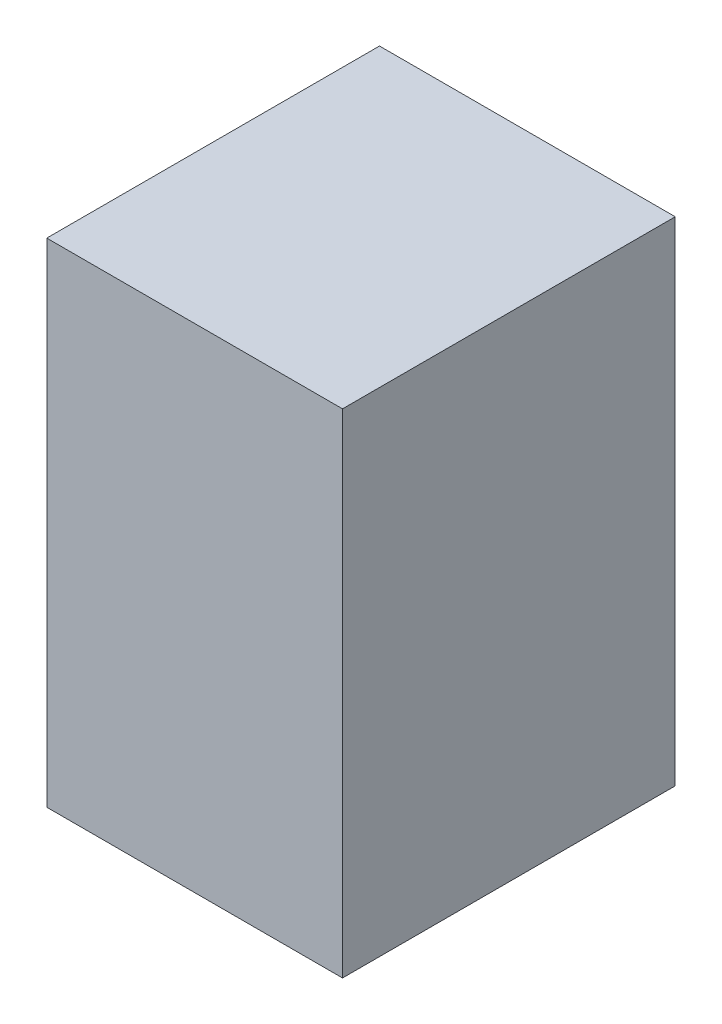
ISO-10303-21;
HEADER;
FILE_DESCRIPTION(('STEP AP214'),'2;1');
FILE_NAME('part.step','',(''),(''),'','','');
FILE_SCHEMA(('AUTOMOTIVE_DESIGN { 1 0 10303 214 1 1 1 1 }'));
ENDSEC;
DATA;
#1=APPLICATION_CONTEXT('core data for automotive mechanical design processes');
#2=APPLICATION_PROTOCOL_DEFINITION('international standard','automotive_design',2000,#1);
#3=PRODUCT_CONTEXT('',#1,'mechanical');
#4=PRODUCT('Part','Part','',(#3));
#5=PRODUCT_RELATED_PRODUCT_CATEGORY('part','',(#4));
#6=PRODUCT_DEFINITION_FORMATION('','',#4);
#7=PRODUCT_DEFINITION_CONTEXT('part definition',#1,'design');
#8=PRODUCT_DEFINITION('design','',#6,#7);
#9=PRODUCT_DEFINITION_SHAPE('','',#8);
#10=(LENGTH_UNIT() NAMED_UNIT(*) SI_UNIT(.MILLI.,.METRE.));
#11=(NAMED_UNIT(*) PLANE_ANGLE_UNIT() SI_UNIT($,.RADIAN.));
#12=(NAMED_UNIT(*) SI_UNIT($,.STERADIAN.) SOLID_ANGLE_UNIT());
#13=UNCERTAINTY_MEASURE_WITH_UNIT(LENGTH_MEASURE(1.E-05),#10,'distance_accuracy_value','');
#14=(GEOMETRIC_REPRESENTATION_CONTEXT(3) GLOBAL_UNCERTAINTY_ASSIGNED_CONTEXT((#13)) GLOBAL_UNIT_ASSIGNED_CONTEXT((#10,
#11,#12)) REPRESENTATION_CONTEXT('',''));
#15=CARTESIAN_POINT('',(0.,0.,0.));
#16=DIRECTION('',(0.,0.,1.));
#17=DIRECTION('',(1.,0.,0.));
#18=AXIS2_PLACEMENT_3D('',#15,#16,#17);
#19=CARTESIAN_POINT('',(0.5999988,1.00000054,0.));
#20=DIRECTION('',(1.,0.,0.));
#21=DIRECTION('',(0.,0.,-1.));
#22=AXIS2_PLACEMENT_3D('',#19,#20,#21);
#23=PLANE('',#22);
#24=DIRECTION('',(0.,0.,-1.));
#25=VECTOR('',#24,1.);
#26=CARTESIAN_POINT('',(0.5999988,-1.00000054,0.));
#27=LINE('',#26,#25);
#28=CARTESIAN_POINT('',(0.5999988,-1.00000054,0.));
#29=VERTEX_POINT('',#28);
#30=CARTESIAN_POINT('',(0.5999988,-1.00000054,1.34999984));
#31=VERTEX_POINT('',#30);
#32=EDGE_CURVE('E19',#29,#31,#27,.F.);
#33=ORIENTED_EDGE('',*,*,#32,.F.);
#34=DIRECTION('',(0.,1.,0.));
#35=VECTOR('',#34,1.);
#36=CARTESIAN_POINT('',(0.5999988,-1.00000054,0.));
#37=LINE('',#36,#35);
#38=CARTESIAN_POINT('',(0.5999988,1.00000054,0.));
#39=VERTEX_POINT('',#38);
#40=EDGE_CURVE('E79',#29,#39,#37,.T.);
#41=ORIENTED_EDGE('',*,*,#40,.T.);
#42=DIRECTION('',(0.,0.,1.));
#43=VECTOR('',#42,1.);
#44=CARTESIAN_POINT('',(0.5999988,1.00000054,0.));
#45=LINE('',#44,#43);
#46=CARTESIAN_POINT('',(0.5999988,1.00000054,1.34999984));
#47=VERTEX_POINT('',#46);
#48=EDGE_CURVE('E67',#47,#39,#45,.F.);
#49=ORIENTED_EDGE('',*,*,#48,.F.);
#50=DIRECTION('',(0.,1.,0.));
#51=VECTOR('',#50,1.);
#52=CARTESIAN_POINT('',(0.5999988,-1.00000054,1.34999984));
#53=LINE('',#52,#51);
#54=EDGE_CURVE('E55',#31,#47,#53,.T.);
#55=ORIENTED_EDGE('',*,*,#54,.F.);
#56=EDGE_LOOP('',(#33,#41,#49,#55));
#57=FACE_BOUND('',#56,.T.);
#58=ADVANCED_FACE('F16',(#57),#23,.T.);
#59=CARTESIAN_POINT('',(0.5999988,-1.00000054,0.));
#60=DIRECTION('',(0.,-1.,0.));
#61=DIRECTION('',(0.,0.,-1.));
#62=AXIS2_PLACEMENT_3D('',#59,#60,#61);
#63=PLANE('',#62);
#64=DIRECTION('',(0.,0.,1.));
#65=VECTOR('',#64,1.);
#66=CARTESIAN_POINT('',(-0.5999988,-1.00000054,0.));
#67=LINE('',#66,#65);
#68=CARTESIAN_POINT('',(-0.5999988,-1.00000054,0.));
#69=VERTEX_POINT('',#68);
#70=CARTESIAN_POINT('',(-0.5999988,-1.00000054,1.34999984));
#71=VERTEX_POINT('',#70);
#72=EDGE_CURVE('E82',#69,#71,#67,.T.);
#73=ORIENTED_EDGE('',*,*,#72,.F.);
#74=DIRECTION('',(1.,0.,0.));
#75=VECTOR('',#74,1.);
#76=CARTESIAN_POINT('',(-0.5999988,-1.00000054,0.));
#77=LINE('',#76,#75);
#78=EDGE_CURVE('E64',#69,#29,#77,.T.);
#79=ORIENTED_EDGE('',*,*,#78,.T.);
#80=ORIENTED_EDGE('',*,*,#32,.T.);
#81=DIRECTION('',(1.,0.,0.));
#82=VECTOR('',#81,1.);
#83=CARTESIAN_POINT('',(-0.5999988,-1.00000054,1.34999984));
#84=LINE('',#83,#82);
#85=EDGE_CURVE('E61',#71,#31,#84,.T.);
#86=ORIENTED_EDGE('',*,*,#85,.F.);
#87=EDGE_LOOP('',(#73,#79,#80,#86));
#88=FACE_BOUND('',#87,.T.);
#89=ADVANCED_FACE('F60',(#88),#63,.T.);
#90=CARTESIAN_POINT('',(-0.5999988,-1.00000054,1.34999984));
#91=DIRECTION('',(0.,0.,1.));
#92=DIRECTION('',(1.,0.,0.));
#93=AXIS2_PLACEMENT_3D('',#90,#91,#92);
#94=PLANE('',#93);
#95=DIRECTION('',(1.,0.,0.));
#96=VECTOR('',#95,1.);
#97=CARTESIAN_POINT('',(-0.5999988,1.00000054,1.34999984));
#98=LINE('',#97,#96);
#99=CARTESIAN_POINT('',(-0.5999988,1.00000054,1.34999984));
#100=VERTEX_POINT('',#99);
#101=EDGE_CURVE('E69',#100,#47,#98,.T.);
#102=ORIENTED_EDGE('',*,*,#101,.F.);
#103=DIRECTION('',(0.,1.,0.));
#104=VECTOR('',#103,1.);
#105=CARTESIAN_POINT('',(-0.5999988,-1.00000054,1.34999984));
#106=LINE('',#105,#104);
#107=EDGE_CURVE('E73',#71,#100,#106,.T.);
#108=ORIENTED_EDGE('',*,*,#107,.F.);
#109=ORIENTED_EDGE('',*,*,#85,.T.);
#110=ORIENTED_EDGE('',*,*,#54,.T.);
#111=EDGE_LOOP('',(#102,#108,#109,#110));
#112=FACE_BOUND('',#111,.T.);
#113=ADVANCED_FACE('F71',(#112),#94,.T.);
#114=CARTESIAN_POINT('',(-0.5999988,1.00000054,0.));
#115=DIRECTION('',(0.,1.,0.));
#116=DIRECTION('',(0.,0.,1.));
#117=AXIS2_PLACEMENT_3D('',#114,#115,#116);
#118=PLANE('',#117);
#119=ORIENTED_EDGE('',*,*,#48,.T.);
#120=DIRECTION('',(1.,0.,0.));
#121=VECTOR('',#120,1.);
#122=CARTESIAN_POINT('',(-0.5999988,1.00000054,0.));
#123=LINE('',#122,#121);
#124=CARTESIAN_POINT('',(-0.5999988,1.00000054,0.));
#125=VERTEX_POINT('',#124);
#126=EDGE_CURVE('E34',#39,#125,#123,.F.);
#127=ORIENTED_EDGE('',*,*,#126,.T.);
#128=DIRECTION('',(0.,0.,1.));
#129=VECTOR('',#128,1.);
#130=CARTESIAN_POINT('',(-0.5999988,1.00000054,0.));
#131=LINE('',#130,#129);
#132=EDGE_CURVE('E25',#100,#125,#131,.F.);
#133=ORIENTED_EDGE('',*,*,#132,.F.);
#134=ORIENTED_EDGE('',*,*,#101,.T.);
#135=EDGE_LOOP('',(#119,#127,#133,#134));
#136=FACE_BOUND('',#135,.T.);
#137=ADVANCED_FACE('F88',(#136),#118,.T.);
#138=CARTESIAN_POINT('',(-0.5999988,-1.00000054,0.));
#139=DIRECTION('',(0.,0.,1.));
#140=DIRECTION('',(1.,0.,0.));
#141=AXIS2_PLACEMENT_3D('',#138,#139,#140);
#142=PLANE('',#141);
#143=ORIENTED_EDGE('',*,*,#126,.F.);
#144=ORIENTED_EDGE('',*,*,#40,.F.);
#145=ORIENTED_EDGE('',*,*,#78,.F.);
#146=DIRECTION('',(0.,1.,0.));
#147=VECTOR('',#146,1.);
#148=CARTESIAN_POINT('',(-0.5999988,-1.00000054,0.));
#149=LINE('',#148,#147);
#150=EDGE_CURVE('E11',#125,#69,#149,.F.);
#151=ORIENTED_EDGE('',*,*,#150,.F.);
#152=EDGE_LOOP('',(#143,#144,#145,#151));
#153=FACE_BOUND('',#152,.T.);
#154=ADVANCED_FACE('F90',(#153),#142,.F.);
#155=CARTESIAN_POINT('',(-0.5999988,-1.00000054,0.));
#156=DIRECTION('',(-1.,0.,0.));
#157=DIRECTION('',(0.,0.,1.));
#158=AXIS2_PLACEMENT_3D('',#155,#156,#157);
#159=PLANE('',#158);
#160=ORIENTED_EDGE('',*,*,#132,.T.);
#161=ORIENTED_EDGE('',*,*,#150,.T.);
#162=ORIENTED_EDGE('',*,*,#72,.T.);
#163=ORIENTED_EDGE('',*,*,#107,.T.);
#164=EDGE_LOOP('',(#160,#161,#162,#163));
#165=FACE_BOUND('',#164,.T.);
#166=ADVANCED_FACE('F87',(#165),#159,.T.);
#167=CLOSED_SHELL('',(#58,#89,#113,#137,#154,#166));
#168=MANIFOLD_SOLID_BREP('B1',#167);
#169=ADVANCED_BREP_SHAPE_REPRESENTATION('',(#18,#168),#14);
#170=SHAPE_DEFINITION_REPRESENTATION(#9,#169);
ENDSEC;
END-ISO-10303-21;
